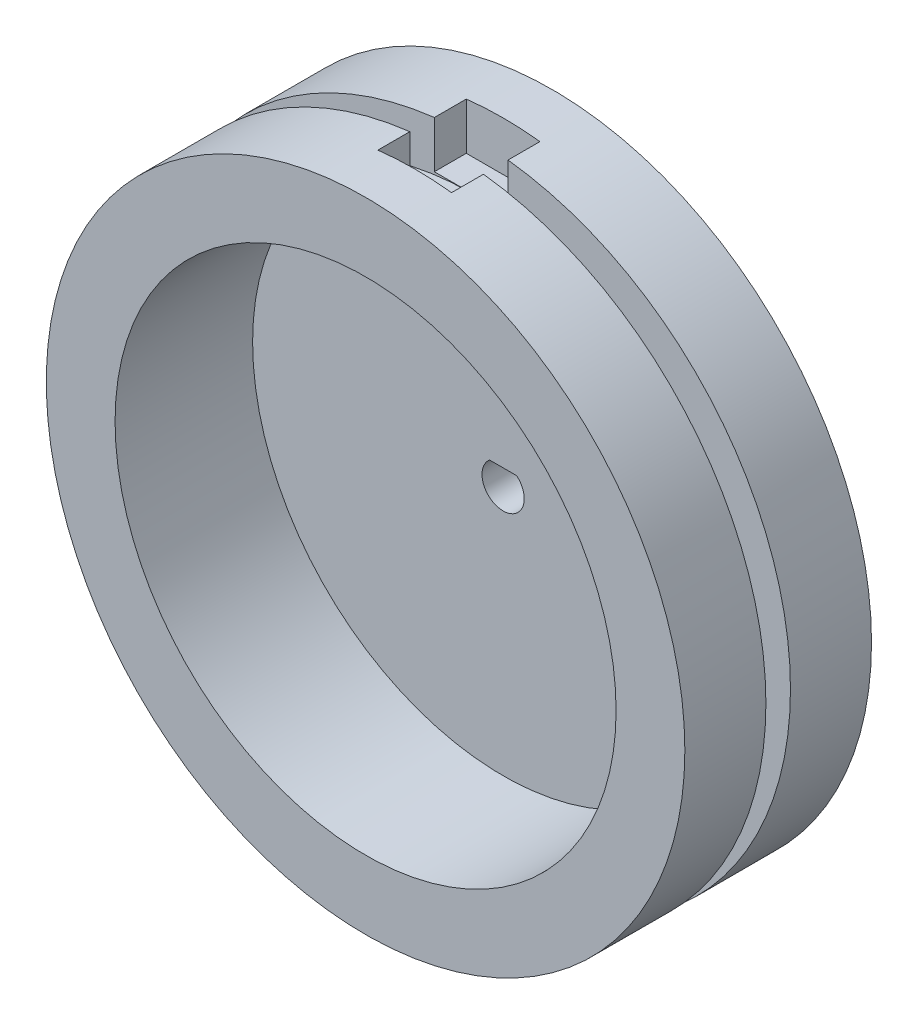
ISO-10303-21;
HEADER;
FILE_DESCRIPTION(('STEP AP214'),'2;1');
FILE_NAME('part.step','',(''),(''),'','','');
FILE_SCHEMA(('AUTOMOTIVE_DESIGN { 1 0 10303 214 1 1 1 1 }'));
ENDSEC;
DATA;
#1=APPLICATION_CONTEXT('core data for automotive mechanical design processes');
#2=APPLICATION_PROTOCOL_DEFINITION('international standard','automotive_design',2000,#1);
#3=PRODUCT_CONTEXT('',#1,'mechanical');
#4=PRODUCT('Part','Part','',(#3));
#5=PRODUCT_RELATED_PRODUCT_CATEGORY('part','',(#4));
#6=PRODUCT_DEFINITION_FORMATION('','',#4);
#7=PRODUCT_DEFINITION_CONTEXT('part definition',#1,'design');
#8=PRODUCT_DEFINITION('design','',#6,#7);
#9=PRODUCT_DEFINITION_SHAPE('','',#8);
#10=(LENGTH_UNIT() NAMED_UNIT(*) SI_UNIT(.MILLI.,.METRE.));
#11=(NAMED_UNIT(*) PLANE_ANGLE_UNIT() SI_UNIT($,.RADIAN.));
#12=(NAMED_UNIT(*) SI_UNIT($,.STERADIAN.) SOLID_ANGLE_UNIT());
#13=UNCERTAINTY_MEASURE_WITH_UNIT(LENGTH_MEASURE(1.E-05),#10,'distance_accuracy_value','');
#14=(GEOMETRIC_REPRESENTATION_CONTEXT(3) GLOBAL_UNCERTAINTY_ASSIGNED_CONTEXT((#13)) GLOBAL_UNIT_ASSIGNED_CONTEXT((#10,
#11,#12)) REPRESENTATION_CONTEXT('',''));
#15=CARTESIAN_POINT('',(0.,0.,0.));
#16=DIRECTION('',(0.,0.,1.));
#17=DIRECTION('',(1.,0.,0.));
#18=AXIS2_PLACEMENT_3D('',#15,#16,#17);
#19=CARTESIAN_POINT('',(0.,0.,5.));
#20=DIRECTION('',(0.,0.,1.));
#21=DIRECTION('',(1.,0.,0.));
#22=AXIS2_PLACEMENT_3D('',#19,#20,#21);
#23=CYLINDRICAL_SURFACE('',#22,32.5);
#24=CARTESIAN_POINT('',(0.,0.,0.));
#25=DIRECTION('',(0.,0.,1.));
#26=DIRECTION('',(1.,0.,0.));
#27=AXIS2_PLACEMENT_3D('',#24,#25,#26);
#28=CIRCLE('',#27,32.5);
#29=CARTESIAN_POINT('',(32.5,0.,0.));
#30=VERTEX_POINT('',#29);
#31=EDGE_CURVE('E301',#30,#30,#28,.T.);
#32=ORIENTED_EDGE('',*,*,#31,.T.);
#33=EDGE_LOOP('',(#32));
#34=FACE_BOUND('',#33,.T.);
#35=DIRECTION('',(0.,0.,1.));
#36=VECTOR('',#35,1.);
#37=CARTESIAN_POINT('',(-3.75,-32.2829289253624,5.));
#38=LINE('',#37,#36);
#39=CARTESIAN_POINT('',(-3.75,-32.2829289253624,8.25));
#40=VERTEX_POINT('',#39);
#41=CARTESIAN_POINT('',(-3.75,-32.2829289253624,5.));
#42=VERTEX_POINT('',#41);
#43=EDGE_CURVE('E223',#40,#42,#38,.F.);
#44=ORIENTED_EDGE('',*,*,#43,.F.);
#45=CARTESIAN_POINT('',(0.,0.,8.25));
#46=DIRECTION('',(0.,0.,1.));
#47=DIRECTION('',(1.,0.,0.));
#48=AXIS2_PLACEMENT_3D('',#45,#46,#47);
#49=CIRCLE('',#48,32.5);
#50=CARTESIAN_POINT('',(-3.75,32.2829289253624,8.25));
#51=VERTEX_POINT('',#50);
#52=EDGE_CURVE('E298',#51,#40,#49,.T.);
#53=ORIENTED_EDGE('',*,*,#52,.F.);
#54=DIRECTION('',(0.,0.,1.));
#55=VECTOR('',#54,1.);
#56=CARTESIAN_POINT('',(-3.75,32.2829289253624,5.));
#57=LINE('',#56,#55);
#58=CARTESIAN_POINT('',(-3.75,32.2829289253624,5.));
#59=VERTEX_POINT('',#58);
#60=EDGE_CURVE('E269',#51,#59,#57,.F.);
#61=ORIENTED_EDGE('',*,*,#60,.T.);
#62=CARTESIAN_POINT('',(0.,0.,5.));
#63=DIRECTION('',(0.,0.,-1.));
#64=DIRECTION('',(-1.,0.,0.));
#65=AXIS2_PLACEMENT_3D('',#62,#63,#64);
#66=CIRCLE('',#65,32.5);
#67=CARTESIAN_POINT('',(3.75,32.2829289253624,5.));
#68=VERTEX_POINT('',#67);
#69=EDGE_CURVE('E317',#59,#68,#66,.T.);
#70=ORIENTED_EDGE('',*,*,#69,.T.);
#71=DIRECTION('',(0.,0.,1.));
#72=VECTOR('',#71,1.);
#73=CARTESIAN_POINT('',(3.75,32.2829289253624,5.));
#74=LINE('',#73,#72);
#75=CARTESIAN_POINT('',(3.75,32.2829289253624,8.25));
#76=VERTEX_POINT('',#75);
#77=EDGE_CURVE('E260',#68,#76,#74,.T.);
#78=ORIENTED_EDGE('',*,*,#77,.T.);
#79=CARTESIAN_POINT('',(3.75,-32.2829289253624,8.25));
#80=VERTEX_POINT('',#79);
#81=EDGE_CURVE('E297',#80,#76,#49,.T.);
#82=ORIENTED_EDGE('',*,*,#81,.F.);
#83=DIRECTION('',(0.,0.,1.));
#84=VECTOR('',#83,1.);
#85=CARTESIAN_POINT('',(3.75,-32.2829289253624,5.));
#86=LINE('',#85,#84);
#87=CARTESIAN_POINT('',(3.75,-32.2829289253624,5.));
#88=VERTEX_POINT('',#87);
#89=EDGE_CURVE('E217',#88,#80,#86,.T.);
#90=ORIENTED_EDGE('',*,*,#89,.F.);
#91=CARTESIAN_POINT('',(0.,0.,5.));
#92=DIRECTION('',(0.,0.,1.));
#93=DIRECTION('',(1.,0.,0.));
#94=AXIS2_PLACEMENT_3D('',#91,#92,#93);
#95=CIRCLE('',#94,32.5);
#96=EDGE_CURVE('E331',#42,#88,#95,.T.);
#97=ORIENTED_EDGE('',*,*,#96,.F.);
#98=EDGE_LOOP('',(#44,#53,#61,#70,#78,#82,#90,#97));
#99=FACE_BOUND('',#98,.T.);
#100=ADVANCED_FACE('F40',(#34,#99),#23,.T.);
#101=CARTESIAN_POINT('',(0.,32.5,8.25));
#102=DIRECTION('',(0.,0.,-1.));
#103=DIRECTION('',(-1.,0.,0.));
#104=AXIS2_PLACEMENT_3D('',#101,#102,#103);
#105=PLANE('',#104);
#106=DIRECTION('',(0.,-1.,0.));
#107=VECTOR('',#106,1.);
#108=CARTESIAN_POINT('',(-3.75,32.5,8.25));
#109=LINE('',#108,#107);
#110=CARTESIAN_POINT('',(-3.75,-27.5,8.25));
#111=VERTEX_POINT('',#110);
#112=EDGE_CURVE('E221',#111,#40,#109,.T.);
#113=ORIENTED_EDGE('',*,*,#112,.F.);
#114=DIRECTION('',(1.,0.,0.));
#115=VECTOR('',#114,1.);
#116=CARTESIAN_POINT('',(0.,-27.5,8.25));
#117=LINE('',#116,#115);
#118=CARTESIAN_POINT('',(0.,-27.5,8.25));
#119=VERTEX_POINT('',#118);
#120=EDGE_CURVE('E229',#111,#119,#117,.T.);
#121=ORIENTED_EDGE('',*,*,#120,.T.);
#122=CARTESIAN_POINT('',(0.,0.,8.25));
#123=DIRECTION('',(0.,0.,1.));
#124=DIRECTION('',(1.,0.,0.));
#125=AXIS2_PLACEMENT_3D('',#122,#123,#124);
#126=CIRCLE('',#125,27.5);
#127=CARTESIAN_POINT('',(0.,27.5,8.25));
#128=VERTEX_POINT('',#127);
#129=EDGE_CURVE('E294',#128,#119,#126,.T.);
#130=ORIENTED_EDGE('',*,*,#129,.F.);
#131=DIRECTION('',(-1.,0.,0.));
#132=VECTOR('',#131,1.);
#133=CARTESIAN_POINT('',(0.,27.5,8.25));
#134=LINE('',#133,#132);
#135=CARTESIAN_POINT('',(-3.75,27.5,8.25));
#136=VERTEX_POINT('',#135);
#137=EDGE_CURVE('E272',#128,#136,#134,.T.);
#138=ORIENTED_EDGE('',*,*,#137,.T.);
#139=DIRECTION('',(0.,1.,0.));
#140=VECTOR('',#139,1.);
#141=CARTESIAN_POINT('',(-3.75,32.5,8.25));
#142=LINE('',#141,#140);
#143=EDGE_CURVE('E266',#136,#51,#142,.T.);
#144=ORIENTED_EDGE('',*,*,#143,.T.);
#145=ORIENTED_EDGE('',*,*,#52,.T.);
#146=EDGE_LOOP('',(#113,#121,#130,#138,#144,#145));
#147=FACE_BOUND('',#146,.T.);
#148=ADVANCED_FACE('F409',(#147),#105,.F.);
#149=DIRECTION('',(0.,1.,0.));
#150=VECTOR('',#149,1.);
#151=CARTESIAN_POINT('',(3.75,32.5,8.25));
#152=LINE('',#151,#150);
#153=CARTESIAN_POINT('',(3.75,-27.5,8.25));
#154=VERTEX_POINT('',#153);
#155=EDGE_CURVE('E214',#80,#154,#152,.T.);
#156=ORIENTED_EDGE('',*,*,#155,.F.);
#157=ORIENTED_EDGE('',*,*,#81,.T.);
#158=DIRECTION('',(0.,-1.,0.));
#159=VECTOR('',#158,1.);
#160=CARTESIAN_POINT('',(3.75,32.5,8.25));
#161=LINE('',#160,#159);
#162=CARTESIAN_POINT('',(3.75,27.5,8.25));
#163=VERTEX_POINT('',#162);
#164=EDGE_CURVE('E257',#76,#163,#161,.T.);
#165=ORIENTED_EDGE('',*,*,#164,.T.);
#166=EDGE_CURVE('E275',#163,#128,#134,.T.);
#167=ORIENTED_EDGE('',*,*,#166,.T.);
#168=EDGE_CURVE('E293',#119,#128,#126,.T.);
#169=ORIENTED_EDGE('',*,*,#168,.F.);
#170=EDGE_CURVE('E226',#119,#154,#117,.T.);
#171=ORIENTED_EDGE('',*,*,#170,.T.);
#172=EDGE_LOOP('',(#156,#157,#165,#167,#169,#171));
#173=FACE_BOUND('',#172,.T.);
#174=ADVANCED_FACE('F415',(#173),#105,.F.);
#175=CARTESIAN_POINT('',(0.,27.5,10.75));
#176=DIRECTION('',(0.,0.,1.));
#177=DIRECTION('',(1.,0.,0.));
#178=AXIS2_PLACEMENT_3D('',#175,#176,#177);
#179=PLANE('',#178);
#180=DIRECTION('',(0.,1.,0.));
#181=VECTOR('',#180,1.);
#182=CARTESIAN_POINT('',(-3.75,27.5,10.75));
#183=LINE('',#182,#181);
#184=CARTESIAN_POINT('',(-3.75,-32.2829289253624,10.75));
#185=VERTEX_POINT('',#184);
#186=CARTESIAN_POINT('',(-3.75,-27.5,10.75));
#187=VERTEX_POINT('',#186);
#188=EDGE_CURVE('E219',#185,#187,#183,.T.);
#189=ORIENTED_EDGE('',*,*,#188,.F.);
#190=CARTESIAN_POINT('',(0.,0.,10.75));
#191=DIRECTION('',(0.,0.,1.));
#192=DIRECTION('',(1.,0.,0.));
#193=AXIS2_PLACEMENT_3D('',#190,#191,#192);
#194=CIRCLE('',#193,32.5);
#195=CARTESIAN_POINT('',(-3.75,32.2829289253624,10.75));
#196=VERTEX_POINT('',#195);
#197=EDGE_CURVE('E286',#196,#185,#194,.T.);
#198=ORIENTED_EDGE('',*,*,#197,.F.);
#199=DIRECTION('',(0.,-1.,0.));
#200=VECTOR('',#199,1.);
#201=CARTESIAN_POINT('',(-3.75,27.5,10.75));
#202=LINE('',#201,#200);
#203=CARTESIAN_POINT('',(-3.75,27.5,10.75));
#204=VERTEX_POINT('',#203);
#205=EDGE_CURVE('E263',#196,#204,#202,.T.);
#206=ORIENTED_EDGE('',*,*,#205,.T.);
#207=DIRECTION('',(1.,0.,0.));
#208=VECTOR('',#207,1.);
#209=CARTESIAN_POINT('',(0.,27.5,10.75));
#210=LINE('',#209,#208);
#211=CARTESIAN_POINT('',(0.,27.5,10.75));
#212=VERTEX_POINT('',#211);
#213=EDGE_CURVE('E316',#204,#212,#210,.T.);
#214=ORIENTED_EDGE('',*,*,#213,.T.);
#215=CARTESIAN_POINT('',(0.,0.,10.75));
#216=DIRECTION('',(0.,0.,1.));
#217=DIRECTION('',(1.,0.,0.));
#218=AXIS2_PLACEMENT_3D('',#215,#216,#217);
#219=CIRCLE('',#218,27.5);
#220=CARTESIAN_POINT('',(0.,-27.5,10.75));
#221=VERTEX_POINT('',#220);
#222=EDGE_CURVE('E290',#212,#221,#219,.T.);
#223=ORIENTED_EDGE('',*,*,#222,.T.);
#224=DIRECTION('',(-1.,0.,0.));
#225=VECTOR('',#224,1.);
#226=CARTESIAN_POINT('',(0.,-27.5,10.75));
#227=LINE('',#226,#225);
#228=EDGE_CURVE('E327',#221,#187,#227,.T.);
#229=ORIENTED_EDGE('',*,*,#228,.T.);
#230=EDGE_LOOP('',(#189,#198,#206,#214,#223,#229));
#231=FACE_BOUND('',#230,.T.);
#232=ADVANCED_FACE('F388',(#231),#179,.F.);
#233=DIRECTION('',(0.,-1.,0.));
#234=VECTOR('',#233,1.);
#235=CARTESIAN_POINT('',(3.75,27.5,10.75));
#236=LINE('',#235,#234);
#237=CARTESIAN_POINT('',(3.75,-27.5,10.75));
#238=VERTEX_POINT('',#237);
#239=CARTESIAN_POINT('',(3.75,-32.2829289253624,10.75));
#240=VERTEX_POINT('',#239);
#241=EDGE_CURVE('E204',#238,#240,#236,.T.);
#242=ORIENTED_EDGE('',*,*,#241,.F.);
#243=EDGE_CURVE('E330',#238,#221,#227,.T.);
#244=ORIENTED_EDGE('',*,*,#243,.T.);
#245=EDGE_CURVE('E289',#221,#212,#219,.T.);
#246=ORIENTED_EDGE('',*,*,#245,.T.);
#247=CARTESIAN_POINT('',(3.75,27.5,10.75));
#248=VERTEX_POINT('',#247);
#249=EDGE_CURVE('E313',#212,#248,#210,.T.);
#250=ORIENTED_EDGE('',*,*,#249,.T.);
#251=DIRECTION('',(0.,1.,0.));
#252=VECTOR('',#251,1.);
#253=CARTESIAN_POINT('',(3.75,27.5,10.75));
#254=LINE('',#253,#252);
#255=CARTESIAN_POINT('',(3.75,32.2829289253624,10.75));
#256=VERTEX_POINT('',#255);
#257=EDGE_CURVE('E247',#248,#256,#254,.T.);
#258=ORIENTED_EDGE('',*,*,#257,.T.);
#259=EDGE_CURVE('E285',#240,#256,#194,.T.);
#260=ORIENTED_EDGE('',*,*,#259,.F.);
#261=EDGE_LOOP('',(#242,#244,#246,#250,#258,#260));
#262=FACE_BOUND('',#261,.T.);
#263=ADVANCED_FACE('F356',(#262),#179,.F.);
#264=CARTESIAN_POINT('',(0.,0.,5.));
#265=DIRECTION('',(0.,0.,1.));
#266=DIRECTION('',(1.,0.,0.));
#267=AXIS2_PLACEMENT_3D('',#264,#265,#266);
#268=CYLINDRICAL_SURFACE('',#267,32.5);
#269=CARTESIAN_POINT('',(0.,0.,19.));
#270=DIRECTION('',(0.,0.,1.));
#271=DIRECTION('',(1.,0.,0.));
#272=AXIS2_PLACEMENT_3D('',#269,#270,#271);
#273=CIRCLE('',#272,32.5);
#274=CARTESIAN_POINT('',(32.5,0.,19.));
#275=VERTEX_POINT('',#274);
#276=EDGE_CURVE('E282',#275,#275,#273,.T.);
#277=ORIENTED_EDGE('',*,*,#276,.F.);
#278=EDGE_LOOP('',(#277));
#279=FACE_BOUND('',#278,.T.);
#280=CARTESIAN_POINT('',(0.,0.,14.));
#281=DIRECTION('',(0.,0.,-1.));
#282=DIRECTION('',(-1.,0.,0.));
#283=AXIS2_PLACEMENT_3D('',#280,#281,#282);
#284=CIRCLE('',#283,32.5);
#285=CARTESIAN_POINT('',(3.75,-32.2829289253624,14.));
#286=VERTEX_POINT('',#285);
#287=CARTESIAN_POINT('',(-3.75,-32.2829289253624,14.));
#288=VERTEX_POINT('',#287);
#289=EDGE_CURVE('E320',#286,#288,#284,.T.);
#290=ORIENTED_EDGE('',*,*,#289,.F.);
#291=DIRECTION('',(0.,0.,1.));
#292=VECTOR('',#291,1.);
#293=CARTESIAN_POINT('',(3.75,-32.2829289253624,5.));
#294=LINE('',#293,#292);
#295=EDGE_CURVE('E324',#240,#286,#294,.T.);
#296=ORIENTED_EDGE('',*,*,#295,.F.);
#297=ORIENTED_EDGE('',*,*,#259,.T.);
#298=DIRECTION('',(0.,0.,1.));
#299=VECTOR('',#298,1.);
#300=CARTESIAN_POINT('',(3.75,32.2829289253624,5.));
#301=LINE('',#300,#299);
#302=CARTESIAN_POINT('',(3.75,32.2829289253624,14.));
#303=VERTEX_POINT('',#302);
#304=EDGE_CURVE('E310',#256,#303,#301,.T.);
#305=ORIENTED_EDGE('',*,*,#304,.T.);
#306=CARTESIAN_POINT('',(0.,0.,14.));
#307=DIRECTION('',(0.,0.,1.));
#308=DIRECTION('',(1.,0.,0.));
#309=AXIS2_PLACEMENT_3D('',#306,#307,#308);
#310=CIRCLE('',#309,32.5);
#311=CARTESIAN_POINT('',(-3.75,32.2829289253624,14.));
#312=VERTEX_POINT('',#311);
#313=EDGE_CURVE('E304',#303,#312,#310,.T.);
#314=ORIENTED_EDGE('',*,*,#313,.T.);
#315=DIRECTION('',(0.,0.,1.));
#316=VECTOR('',#315,1.);
#317=CARTESIAN_POINT('',(-3.75,32.2829289253624,5.));
#318=LINE('',#317,#316);
#319=EDGE_CURVE('E307',#312,#196,#318,.F.);
#320=ORIENTED_EDGE('',*,*,#319,.T.);
#321=ORIENTED_EDGE('',*,*,#197,.T.);
#322=DIRECTION('',(0.,0.,1.));
#323=VECTOR('',#322,1.);
#324=CARTESIAN_POINT('',(-3.75,-32.2829289253624,5.));
#325=LINE('',#324,#323);
#326=EDGE_CURVE('E322',#288,#185,#325,.F.);
#327=ORIENTED_EDGE('',*,*,#326,.F.);
#328=EDGE_LOOP('',(#290,#296,#297,#305,#314,#320,#321,#327));
#329=FACE_BOUND('',#328,.T.);
#330=ADVANCED_FACE('F353',(#279,#329),#268,.T.);
#331=CARTESIAN_POINT('',(0.,0.,0.));
#332=DIRECTION('',(0.,0.,1.));
#333=DIRECTION('',(1.,0.,0.));
#334=AXIS2_PLACEMENT_3D('',#331,#332,#333);
#335=PLANE('',#334);
#336=DIRECTION('',(1.,0.,0.));
#337=VECTOR('',#336,1.);
#338=CARTESIAN_POINT('',(1.37840487520902,1.65,0.));
#339=LINE('',#338,#337);
#340=CARTESIAN_POINT('',(-1.37840487520902,1.65,0.));
#341=VERTEX_POINT('',#340);
#342=CARTESIAN_POINT('',(1.37840487520902,1.65,0.));
#343=VERTEX_POINT('',#342);
#344=EDGE_CURVE('E181',#341,#343,#339,.T.);
#345=ORIENTED_EDGE('',*,*,#344,.F.);
#346=CARTESIAN_POINT('',(0.,0.,0.));
#347=DIRECTION('',(0.,0.,-1.));
#348=DIRECTION('',(-1.,0.,0.));
#349=AXIS2_PLACEMENT_3D('',#346,#347,#348);
#350=CIRCLE('',#349,2.15);
#351=EDGE_CURVE('E55',#343,#341,#350,.T.);
#352=ORIENTED_EDGE('',*,*,#351,.F.);
#353=EDGE_LOOP('',(#345,#352));
#354=FACE_BOUND('',#353,.T.);
#355=ORIENTED_EDGE('',*,*,#31,.F.);
#356=EDGE_LOOP('',(#355));
#357=FACE_BOUND('',#356,.T.);
#358=ADVANCED_FACE('F42',(#354,#357),#335,.F.);
#359=CARTESIAN_POINT('',(0.,0.,5.));
#360=DIRECTION('',(0.,0.,1.));
#361=DIRECTION('',(1.,0.,0.));
#362=AXIS2_PLACEMENT_3D('',#359,#360,#361);
#363=CYLINDRICAL_SURFACE('',#362,27.5);
#364=ORIENTED_EDGE('',*,*,#245,.F.);
#365=ORIENTED_EDGE('',*,*,#222,.F.);
#366=EDGE_LOOP('',(#364,#365));
#367=FACE_BOUND('',#366,.T.);
#368=ORIENTED_EDGE('',*,*,#129,.T.);
#369=ORIENTED_EDGE('',*,*,#168,.T.);
#370=EDGE_LOOP('',(#368,#369));
#371=FACE_BOUND('',#370,.T.);
#372=ADVANCED_FACE('F349',(#367,#371),#363,.T.);
#373=CARTESIAN_POINT('',(0.,32.5,19.));
#374=DIRECTION('',(0.,0.,-1.));
#375=DIRECTION('',(-1.,0.,0.));
#376=AXIS2_PLACEMENT_3D('',#373,#374,#375);
#377=PLANE('',#376);
#378=CARTESIAN_POINT('',(0.,0.,19.));
#379=DIRECTION('',(0.,0.,1.));
#380=DIRECTION('',(1.,0.,0.));
#381=AXIS2_PLACEMENT_3D('',#378,#379,#380);
#382=CIRCLE('',#381,25.5);
#383=CARTESIAN_POINT('',(25.5,0.,19.));
#384=VERTEX_POINT('',#383);
#385=EDGE_CURVE('E279',#384,#384,#382,.T.);
#386=ORIENTED_EDGE('',*,*,#385,.F.);
#387=EDGE_LOOP('',(#386));
#388=FACE_BOUND('',#387,.T.);
#389=ORIENTED_EDGE('',*,*,#276,.T.);
#390=EDGE_LOOP('',(#389));
#391=FACE_BOUND('',#390,.T.);
#392=ADVANCED_FACE('F343',(#388,#391),#377,.F.);
#393=CARTESIAN_POINT('',(0.,0.,5.));
#394=DIRECTION('',(0.,0.,1.));
#395=DIRECTION('',(1.,0.,0.));
#396=AXIS2_PLACEMENT_3D('',#393,#394,#395);
#397=CYLINDRICAL_SURFACE('',#396,25.5);
#398=CARTESIAN_POINT('',(0.,0.,5.));
#399=DIRECTION('',(0.,0.,1.));
#400=DIRECTION('',(1.,0.,0.));
#401=AXIS2_PLACEMENT_3D('',#398,#399,#400);
#402=CIRCLE('',#401,25.5);
#403=CARTESIAN_POINT('',(25.5,0.,5.));
#404=VERTEX_POINT('',#403);
#405=EDGE_CURVE('E276',#404,#404,#402,.T.);
#406=ORIENTED_EDGE('',*,*,#405,.F.);
#407=EDGE_LOOP('',(#406));
#408=FACE_BOUND('',#407,.T.);
#409=ORIENTED_EDGE('',*,*,#385,.T.);
#410=EDGE_LOOP('',(#409));
#411=FACE_BOUND('',#410,.T.);
#412=ADVANCED_FACE('F337',(#408,#411),#397,.F.);
#413=CARTESIAN_POINT('',(0.,25.5,5.));
#414=DIRECTION('',(0.,0.,-1.));
#415=DIRECTION('',(-1.,0.,0.));
#416=AXIS2_PLACEMENT_3D('',#413,#414,#415);
#417=PLANE('',#416);
#418=DIRECTION('',(1.,0.,0.));
#419=VECTOR('',#418,1.);
#420=CARTESIAN_POINT('',(0.,1.65,5.));
#421=LINE('',#420,#419);
#422=CARTESIAN_POINT('',(-1.37840487520902,1.65,5.));
#423=VERTEX_POINT('',#422);
#424=CARTESIAN_POINT('',(1.37840487520902,1.65,5.));
#425=VERTEX_POINT('',#424);
#426=EDGE_CURVE('E48',#423,#425,#421,.T.);
#427=ORIENTED_EDGE('',*,*,#426,.T.);
#428=CARTESIAN_POINT('',(0.,0.,5.));
#429=DIRECTION('',(0.,0.,-1.));
#430=DIRECTION('',(-1.,0.,0.));
#431=AXIS2_PLACEMENT_3D('',#428,#429,#430);
#432=CIRCLE('',#431,2.15);
#433=EDGE_CURVE('E11',#425,#423,#432,.T.);
#434=ORIENTED_EDGE('',*,*,#433,.T.);
#435=EDGE_LOOP('',(#427,#434));
#436=FACE_BOUND('',#435,.T.);
#437=ORIENTED_EDGE('',*,*,#405,.T.);
#438=EDGE_LOOP('',(#437));
#439=FACE_BOUND('',#438,.T.);
#440=ADVANCED_FACE('F333',(#436,#439),#417,.F.);
#441=CARTESIAN_POINT('',(-3.75,27.5,14.));
#442=DIRECTION('',(0.,0.,1.));
#443=DIRECTION('',(1.,0.,0.));
#444=AXIS2_PLACEMENT_3D('',#441,#442,#443);
#445=PLANE('',#444);
#446=DIRECTION('',(0.,1.,0.));
#447=VECTOR('',#446,1.);
#448=CARTESIAN_POINT('',(3.75,27.5,14.));
#449=LINE('',#448,#447);
#450=CARTESIAN_POINT('',(3.75,27.5,14.));
#451=VERTEX_POINT('',#450);
#452=EDGE_CURVE('E251',#451,#303,#449,.T.);
#453=ORIENTED_EDGE('',*,*,#452,.F.);
#454=DIRECTION('',(1.,0.,0.));
#455=VECTOR('',#454,1.);
#456=CARTESIAN_POINT('',(-3.75,27.5,14.));
#457=LINE('',#456,#455);
#458=CARTESIAN_POINT('',(-3.75,27.5,14.));
#459=VERTEX_POINT('',#458);
#460=EDGE_CURVE('E232',#459,#451,#457,.T.);
#461=ORIENTED_EDGE('',*,*,#460,.F.);
#462=DIRECTION('',(0.,1.,0.));
#463=VECTOR('',#462,1.);
#464=CARTESIAN_POINT('',(-3.75,27.5,14.));
#465=LINE('',#464,#463);
#466=EDGE_CURVE('E243',#459,#312,#465,.T.);
#467=ORIENTED_EDGE('',*,*,#466,.T.);
#468=ORIENTED_EDGE('',*,*,#313,.F.);
#469=EDGE_LOOP('',(#453,#461,#467,#468));
#470=FACE_BOUND('',#469,.T.);
#471=ADVANCED_FACE('F336',(#470),#445,.F.);
#472=CARTESIAN_POINT('',(3.75,27.5,14.));
#473=DIRECTION('',(1.,0.,0.));
#474=DIRECTION('',(0.,0.,-1.));
#475=AXIS2_PLACEMENT_3D('',#472,#473,#474);
#476=PLANE('',#475);
#477=DIRECTION('',(0.,0.,-1.));
#478=VECTOR('',#477,1.);
#479=CARTESIAN_POINT('',(3.75,27.5,14.));
#480=LINE('',#479,#478);
#481=EDGE_CURVE('E237',#451,#248,#480,.T.);
#482=ORIENTED_EDGE('',*,*,#481,.F.);
#483=ORIENTED_EDGE('',*,*,#452,.T.);
#484=ORIENTED_EDGE('',*,*,#304,.F.);
#485=ORIENTED_EDGE('',*,*,#257,.F.);
#486=EDGE_LOOP('',(#482,#483,#484,#485));
#487=FACE_BOUND('',#486,.T.);
#488=ADVANCED_FACE('F379',(#487),#476,.F.);
#489=CARTESIAN_POINT('',(-3.75,27.5,14.));
#490=DIRECTION('',(-1.,0.,0.));
#491=DIRECTION('',(0.,0.,1.));
#492=AXIS2_PLACEMENT_3D('',#489,#490,#491);
#493=PLANE('',#492);
#494=ORIENTED_EDGE('',*,*,#319,.F.);
#495=ORIENTED_EDGE('',*,*,#466,.F.);
#496=DIRECTION('',(0.,0.,1.));
#497=VECTOR('',#496,1.);
#498=CARTESIAN_POINT('',(-3.75,27.5,14.));
#499=LINE('',#498,#497);
#500=EDGE_CURVE('E233',#204,#459,#499,.T.);
#501=ORIENTED_EDGE('',*,*,#500,.F.);
#502=ORIENTED_EDGE('',*,*,#205,.F.);
#503=EDGE_LOOP('',(#494,#495,#501,#502));
#504=FACE_BOUND('',#503,.T.);
#505=ADVANCED_FACE('F431',(#504),#493,.F.);
#506=CARTESIAN_POINT('',(0.,27.5,0.));
#507=DIRECTION('',(0.,-1.,0.));
#508=DIRECTION('',(0.,0.,-1.));
#509=AXIS2_PLACEMENT_3D('',#506,#507,#508);
#510=PLANE('',#509);
#511=ORIENTED_EDGE('',*,*,#500,.T.);
#512=ORIENTED_EDGE('',*,*,#460,.T.);
#513=ORIENTED_EDGE('',*,*,#481,.T.);
#514=ORIENTED_EDGE('',*,*,#249,.F.);
#515=ORIENTED_EDGE('',*,*,#213,.F.);
#516=EDGE_LOOP('',(#511,#512,#513,#514,#515));
#517=FACE_BOUND('',#516,.T.);
#518=ADVANCED_FACE('F438',(#517),#510,.F.);
#519=CARTESIAN_POINT('',(-3.75,27.5,5.));
#520=DIRECTION('',(0.,0.,-1.));
#521=DIRECTION('',(-1.,0.,0.));
#522=AXIS2_PLACEMENT_3D('',#519,#520,#521);
#523=PLANE('',#522);
#524=DIRECTION('',(0.,1.,0.));
#525=VECTOR('',#524,1.);
#526=CARTESIAN_POINT('',(-3.75,27.5,5.));
#527=LINE('',#526,#525);
#528=CARTESIAN_POINT('',(-3.75,27.5,5.));
#529=VERTEX_POINT('',#528);
#530=EDGE_CURVE('E244',#529,#59,#527,.T.);
#531=ORIENTED_EDGE('',*,*,#530,.F.);
#532=DIRECTION('',(-1.,0.,0.));
#533=VECTOR('',#532,1.);
#534=CARTESIAN_POINT('',(-3.75,27.5,5.));
#535=LINE('',#534,#533);
#536=CARTESIAN_POINT('',(3.75,27.5,5.));
#537=VERTEX_POINT('',#536);
#538=EDGE_CURVE('E240',#537,#529,#535,.T.);
#539=ORIENTED_EDGE('',*,*,#538,.F.);
#540=DIRECTION('',(0.,1.,0.));
#541=VECTOR('',#540,1.);
#542=CARTESIAN_POINT('',(3.75,27.5,5.));
#543=LINE('',#542,#541);
#544=EDGE_CURVE('E248',#537,#68,#543,.T.);
#545=ORIENTED_EDGE('',*,*,#544,.T.);
#546=ORIENTED_EDGE('',*,*,#69,.F.);
#547=EDGE_LOOP('',(#531,#539,#545,#546));
#548=FACE_BOUND('',#547,.T.);
#549=ADVANCED_FACE('F436',(#548),#523,.F.);
#550=EDGE_CURVE('E236',#163,#537,#480,.T.);
#551=ORIENTED_EDGE('',*,*,#550,.T.);
#552=ORIENTED_EDGE('',*,*,#538,.T.);
#553=EDGE_CURVE('E230',#529,#136,#499,.T.);
#554=ORIENTED_EDGE('',*,*,#553,.T.);
#555=ORIENTED_EDGE('',*,*,#137,.F.);
#556=ORIENTED_EDGE('',*,*,#166,.F.);
#557=EDGE_LOOP('',(#551,#552,#554,#555,#556));
#558=FACE_BOUND('',#557,.T.);
#559=ADVANCED_FACE('F429',(#558),#510,.F.);
#560=ORIENTED_EDGE('',*,*,#143,.F.);
#561=ORIENTED_EDGE('',*,*,#553,.F.);
#562=ORIENTED_EDGE('',*,*,#530,.T.);
#563=ORIENTED_EDGE('',*,*,#60,.F.);
#564=EDGE_LOOP('',(#560,#561,#562,#563));
#565=FACE_BOUND('',#564,.T.);
#566=ADVANCED_FACE('F425',(#565),#493,.F.);
#567=ORIENTED_EDGE('',*,*,#544,.F.);
#568=ORIENTED_EDGE('',*,*,#550,.F.);
#569=ORIENTED_EDGE('',*,*,#164,.F.);
#570=ORIENTED_EDGE('',*,*,#77,.F.);
#571=EDGE_LOOP('',(#567,#568,#569,#570));
#572=FACE_BOUND('',#571,.T.);
#573=ADVANCED_FACE('F428',(#572),#476,.F.);
#574=CARTESIAN_POINT('',(3.75,-27.5,14.));
#575=DIRECTION('',(-1.,0.,0.));
#576=DIRECTION('',(0.,0.,1.));
#577=AXIS2_PLACEMENT_3D('',#574,#575,#576);
#578=PLANE('',#577);
#579=ORIENTED_EDGE('',*,*,#241,.T.);
#580=ORIENTED_EDGE('',*,*,#295,.T.);
#581=DIRECTION('',(0.,-1.,0.));
#582=VECTOR('',#581,1.);
#583=CARTESIAN_POINT('',(3.75,-27.5,14.));
#584=LINE('',#583,#582);
#585=CARTESIAN_POINT('',(3.75,-27.5,14.));
#586=VERTEX_POINT('',#585);
#587=EDGE_CURVE('E205',#586,#286,#584,.T.);
#588=ORIENTED_EDGE('',*,*,#587,.F.);
#589=DIRECTION('',(0.,0.,-1.));
#590=VECTOR('',#589,1.);
#591=CARTESIAN_POINT('',(3.75,-27.5,14.));
#592=LINE('',#591,#590);
#593=EDGE_CURVE('E195',#586,#238,#592,.T.);
#594=ORIENTED_EDGE('',*,*,#593,.T.);
#595=EDGE_LOOP('',(#579,#580,#588,#594));
#596=FACE_BOUND('',#595,.T.);
#597=ADVANCED_FACE('F365',(#596),#578,.T.);
#598=CARTESIAN_POINT('',(-3.75,-27.5,14.));
#599=DIRECTION('',(0.,0.,-1.));
#600=DIRECTION('',(-1.,0.,0.));
#601=AXIS2_PLACEMENT_3D('',#598,#599,#600);
#602=PLANE('',#601);
#603=ORIENTED_EDGE('',*,*,#587,.T.);
#604=ORIENTED_EDGE('',*,*,#289,.T.);
#605=DIRECTION('',(0.,-1.,0.));
#606=VECTOR('',#605,1.);
#607=CARTESIAN_POINT('',(-3.75,-27.5,14.));
#608=LINE('',#607,#606);
#609=CARTESIAN_POINT('',(-3.75,-27.5,14.));
#610=VERTEX_POINT('',#609);
#611=EDGE_CURVE('E201',#610,#288,#608,.T.);
#612=ORIENTED_EDGE('',*,*,#611,.F.);
#613=DIRECTION('',(1.,0.,0.));
#614=VECTOR('',#613,1.);
#615=CARTESIAN_POINT('',(-3.75,-27.5,14.));
#616=LINE('',#615,#614);
#617=EDGE_CURVE('E198',#610,#586,#616,.T.);
#618=ORIENTED_EDGE('',*,*,#617,.T.);
#619=EDGE_LOOP('',(#603,#604,#612,#618));
#620=FACE_BOUND('',#619,.T.);
#621=ADVANCED_FACE('F368',(#620),#602,.T.);
#622=CARTESIAN_POINT('',(-3.75,-27.5,14.));
#623=DIRECTION('',(1.,0.,0.));
#624=DIRECTION('',(0.,0.,-1.));
#625=AXIS2_PLACEMENT_3D('',#622,#623,#624);
#626=PLANE('',#625);
#627=ORIENTED_EDGE('',*,*,#188,.T.);
#628=DIRECTION('',(0.,0.,1.));
#629=VECTOR('',#628,1.);
#630=CARTESIAN_POINT('',(-3.75,-27.5,14.));
#631=LINE('',#630,#629);
#632=EDGE_CURVE('E177',#187,#610,#631,.T.);
#633=ORIENTED_EDGE('',*,*,#632,.T.);
#634=ORIENTED_EDGE('',*,*,#611,.T.);
#635=ORIENTED_EDGE('',*,*,#326,.T.);
#636=EDGE_LOOP('',(#627,#633,#634,#635));
#637=FACE_BOUND('',#636,.T.);
#638=ADVANCED_FACE('F391',(#637),#626,.T.);
#639=CARTESIAN_POINT('',(0.,-27.5,0.));
#640=DIRECTION('',(0.,1.,0.));
#641=DIRECTION('',(0.,0.,-1.));
#642=AXIS2_PLACEMENT_3D('',#639,#640,#641);
#643=PLANE('',#642);
#644=ORIENTED_EDGE('',*,*,#593,.F.);
#645=ORIENTED_EDGE('',*,*,#617,.F.);
#646=ORIENTED_EDGE('',*,*,#632,.F.);
#647=ORIENTED_EDGE('',*,*,#228,.F.);
#648=ORIENTED_EDGE('',*,*,#243,.F.);
#649=EDGE_LOOP('',(#644,#645,#646,#647,#648));
#650=FACE_BOUND('',#649,.T.);
#651=ADVANCED_FACE('F372',(#650),#643,.F.);
#652=CARTESIAN_POINT('',(-3.75,-27.5,5.));
#653=DIRECTION('',(0.,0.,1.));
#654=DIRECTION('',(1.,0.,0.));
#655=AXIS2_PLACEMENT_3D('',#652,#653,#654);
#656=PLANE('',#655);
#657=DIRECTION('',(0.,-1.,0.));
#658=VECTOR('',#657,1.);
#659=CARTESIAN_POINT('',(-3.75,-27.5,5.));
#660=LINE('',#659,#658);
#661=CARTESIAN_POINT('',(-3.75,-27.5,5.));
#662=VERTEX_POINT('',#661);
#663=EDGE_CURVE('E200',#662,#42,#660,.T.);
#664=ORIENTED_EDGE('',*,*,#663,.T.);
#665=ORIENTED_EDGE('',*,*,#96,.T.);
#666=DIRECTION('',(0.,-1.,0.));
#667=VECTOR('',#666,1.);
#668=CARTESIAN_POINT('',(3.75,-27.5,5.));
#669=LINE('',#668,#667);
#670=CARTESIAN_POINT('',(3.75,-27.5,5.));
#671=VERTEX_POINT('',#670);
#672=EDGE_CURVE('E208',#671,#88,#669,.T.);
#673=ORIENTED_EDGE('',*,*,#672,.F.);
#674=DIRECTION('',(-1.,0.,0.));
#675=VECTOR('',#674,1.);
#676=CARTESIAN_POINT('',(-3.75,-27.5,5.));
#677=LINE('',#676,#675);
#678=EDGE_CURVE('E192',#671,#662,#677,.T.);
#679=ORIENTED_EDGE('',*,*,#678,.T.);
#680=EDGE_LOOP('',(#664,#665,#673,#679));
#681=FACE_BOUND('',#680,.T.);
#682=ADVANCED_FACE('F399',(#681),#656,.T.);
#683=EDGE_CURVE('E189',#662,#111,#631,.T.);
#684=ORIENTED_EDGE('',*,*,#683,.F.);
#685=ORIENTED_EDGE('',*,*,#678,.F.);
#686=EDGE_CURVE('E194',#154,#671,#592,.T.);
#687=ORIENTED_EDGE('',*,*,#686,.F.);
#688=ORIENTED_EDGE('',*,*,#170,.F.);
#689=ORIENTED_EDGE('',*,*,#120,.F.);
#690=EDGE_LOOP('',(#684,#685,#687,#688,#689));
#691=FACE_BOUND('',#690,.T.);
#692=ADVANCED_FACE('F401',(#691),#643,.F.);
#693=ORIENTED_EDGE('',*,*,#43,.T.);
#694=ORIENTED_EDGE('',*,*,#663,.F.);
#695=ORIENTED_EDGE('',*,*,#683,.T.);
#696=ORIENTED_EDGE('',*,*,#112,.T.);
#697=EDGE_LOOP('',(#693,#694,#695,#696));
#698=FACE_BOUND('',#697,.T.);
#699=ADVANCED_FACE('F394',(#698),#626,.T.);
#700=ORIENTED_EDGE('',*,*,#89,.T.);
#701=ORIENTED_EDGE('',*,*,#155,.T.);
#702=ORIENTED_EDGE('',*,*,#686,.T.);
#703=ORIENTED_EDGE('',*,*,#672,.T.);
#704=EDGE_LOOP('',(#700,#701,#702,#703));
#705=FACE_BOUND('',#704,.T.);
#706=ADVANCED_FACE('F406',(#705),#578,.T.);
#707=CARTESIAN_POINT('',(0.,0.,19.));
#708=DIRECTION('',(0.,0.,-1.));
#709=DIRECTION('',(-1.,0.,0.));
#710=AXIS2_PLACEMENT_3D('',#707,#708,#709);
#711=CYLINDRICAL_SURFACE('',#710,2.15);
#712=DIRECTION('',(0.,0.,-1.));
#713=VECTOR('',#712,1.);
#714=CARTESIAN_POINT('',(1.37840487520902,1.65,19.));
#715=LINE('',#714,#713);
#716=EDGE_CURVE('E62',#425,#343,#715,.T.);
#717=ORIENTED_EDGE('',*,*,#716,.T.);
#718=ORIENTED_EDGE('',*,*,#351,.T.);
#719=DIRECTION('',(0.,0.,-1.));
#720=VECTOR('',#719,1.);
#721=CARTESIAN_POINT('',(-1.37840487520902,1.65,19.));
#722=LINE('',#721,#720);
#723=EDGE_CURVE('E178',#423,#341,#722,.T.);
#724=ORIENTED_EDGE('',*,*,#723,.F.);
#725=ORIENTED_EDGE('',*,*,#433,.F.);
#726=EDGE_LOOP('',(#717,#718,#724,#725));
#727=FACE_BOUND('',#726,.T.);
#728=ADVANCED_FACE('F175',(#727),#711,.F.);
#729=CARTESIAN_POINT('',(1.37840487520902,1.65,19.));
#730=DIRECTION('',(0.,1.,0.));
#731=DIRECTION('',(0.,0.,1.));
#732=AXIS2_PLACEMENT_3D('',#729,#730,#731);
#733=PLANE('',#732);
#734=ORIENTED_EDGE('',*,*,#723,.T.);
#735=ORIENTED_EDGE('',*,*,#344,.T.);
#736=ORIENTED_EDGE('',*,*,#716,.F.);
#737=ORIENTED_EDGE('',*,*,#426,.F.);
#738=EDGE_LOOP('',(#734,#735,#736,#737));
#739=FACE_BOUND('',#738,.T.);
#740=ADVANCED_FACE('F182',(#739),#733,.F.);
#741=CLOSED_SHELL('',(#100,#148,#174,#232,#263,#330,#358,#372,#392,#412,#440,#471,#488,#505,
#518,#549,#559,#566,#573,#597,#621,#638,#651,#682,#692,#699,#706,#728,#740));
#742=MANIFOLD_SOLID_BREP('B2',#741);
#743=ADVANCED_BREP_SHAPE_REPRESENTATION('',(#18,#742),#14);
#744=SHAPE_DEFINITION_REPRESENTATION(#9,#743);
ENDSEC;
END-ISO-10303-21;
